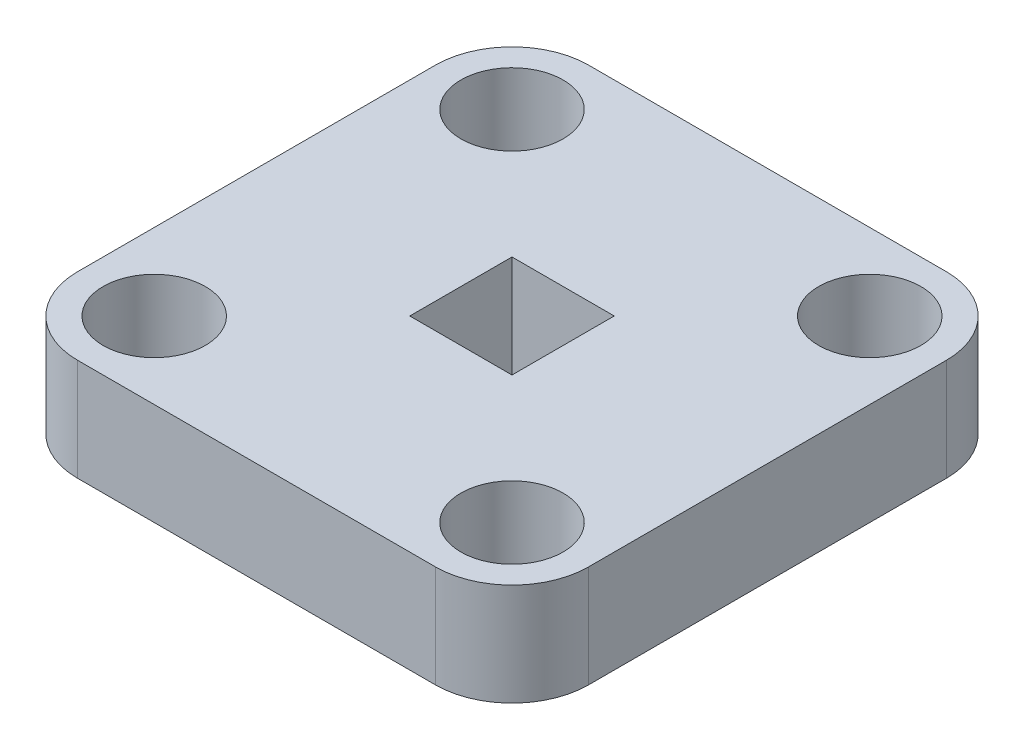
ISO-10303-21;
HEADER;
FILE_DESCRIPTION(('STEP AP214'),'2;1');
FILE_NAME('part.step','',(''),(''),'','','');
FILE_SCHEMA(('AUTOMOTIVE_DESIGN { 1 0 10303 214 1 1 1 1 }'));
ENDSEC;
DATA;
#1=APPLICATION_CONTEXT('core data for automotive mechanical design processes');
#2=APPLICATION_PROTOCOL_DEFINITION('international standard','automotive_design',2000,#1);
#3=PRODUCT_CONTEXT('',#1,'mechanical');
#4=PRODUCT('Part','Part','',(#3));
#5=PRODUCT_RELATED_PRODUCT_CATEGORY('part','',(#4));
#6=PRODUCT_DEFINITION_FORMATION('','',#4);
#7=PRODUCT_DEFINITION_CONTEXT('part definition',#1,'design');
#8=PRODUCT_DEFINITION('design','',#6,#7);
#9=PRODUCT_DEFINITION_SHAPE('','',#8);
#10=(LENGTH_UNIT() NAMED_UNIT(*) SI_UNIT(.MILLI.,.METRE.));
#11=(NAMED_UNIT(*) PLANE_ANGLE_UNIT() SI_UNIT($,.RADIAN.));
#12=(NAMED_UNIT(*) SI_UNIT($,.STERADIAN.) SOLID_ANGLE_UNIT());
#13=UNCERTAINTY_MEASURE_WITH_UNIT(LENGTH_MEASURE(1.E-05),#10,'distance_accuracy_value','');
#14=(GEOMETRIC_REPRESENTATION_CONTEXT(3) GLOBAL_UNCERTAINTY_ASSIGNED_CONTEXT((#13)) GLOBAL_UNIT_ASSIGNED_CONTEXT((#10,
#11,#12)) REPRESENTATION_CONTEXT('',''));
#15=CARTESIAN_POINT('',(0.,0.,0.));
#16=DIRECTION('',(0.,0.,1.));
#17=DIRECTION('',(1.,0.,0.));
#18=AXIS2_PLACEMENT_3D('',#15,#16,#17);
#19=CARTESIAN_POINT('',(0.,4.,0.));
#20=DIRECTION('',(0.,1.,0.));
#21=DIRECTION('',(0.,0.,1.));
#22=AXIS2_PLACEMENT_3D('',#19,#20,#21);
#23=PLANE('',#22);
#24=CARTESIAN_POINT('',(7.,4.,7.));
#25=DIRECTION('',(0.,1.,0.));
#26=DIRECTION('',(0.,0.,1.));
#27=AXIS2_PLACEMENT_3D('',#24,#25,#26);
#28=CIRCLE('',#27,2.);
#29=CARTESIAN_POINT('',(7.,4.,9.));
#30=VERTEX_POINT('',#29);
#31=EDGE_CURVE('E482',#30,#30,#28,.T.);
#32=ORIENTED_EDGE('',*,*,#31,.F.);
#33=EDGE_LOOP('',(#32));
#34=FACE_BOUND('',#33,.T.);
#35=CARTESIAN_POINT('',(-7.,4.,-7.));
#36=DIRECTION('',(0.,1.,0.));
#37=DIRECTION('',(0.,0.,1.));
#38=AXIS2_PLACEMENT_3D('',#35,#36,#37);
#39=CIRCLE('',#38,2.);
#40=CARTESIAN_POINT('',(-7.,4.,-5.));
#41=VERTEX_POINT('',#40);
#42=EDGE_CURVE('E177',#41,#41,#39,.T.);
#43=ORIENTED_EDGE('',*,*,#42,.F.);
#44=EDGE_LOOP('',(#43));
#45=FACE_BOUND('',#44,.T.);
#46=DIRECTION('',(1.,0.,0.));
#47=VECTOR('',#46,1.);
#48=CARTESIAN_POINT('',(-10.,4.,10.));
#49=LINE('',#48,#47);
#50=CARTESIAN_POINT('',(-7.,4.,10.));
#51=VERTEX_POINT('',#50);
#52=CARTESIAN_POINT('',(7.,4.,10.));
#53=VERTEX_POINT('',#52);
#54=EDGE_CURVE('E198',#51,#53,#49,.T.);
#55=ORIENTED_EDGE('',*,*,#54,.T.);
#56=CARTESIAN_POINT('',(7.,4.,7.));
#57=DIRECTION('',(0.,1.,0.));
#58=DIRECTION('',(0.,0.,1.));
#59=AXIS2_PLACEMENT_3D('',#56,#57,#58);
#60=CIRCLE('',#59,3.);
#61=CARTESIAN_POINT('',(10.,4.,7.));
#62=VERTEX_POINT('',#61);
#63=EDGE_CURVE('E256',#53,#62,#60,.T.);
#64=ORIENTED_EDGE('',*,*,#63,.T.);
#65=DIRECTION('',(0.,0.,-1.));
#66=VECTOR('',#65,1.);
#67=CARTESIAN_POINT('',(10.,4.,-10.));
#68=LINE('',#67,#66);
#69=CARTESIAN_POINT('',(10.,4.,-7.));
#70=VERTEX_POINT('',#69);
#71=EDGE_CURVE('E203',#62,#70,#68,.T.);
#72=ORIENTED_EDGE('',*,*,#71,.T.);
#73=CARTESIAN_POINT('',(7.,4.,-7.));
#74=DIRECTION('',(0.,1.,0.));
#75=DIRECTION('',(0.,0.,1.));
#76=AXIS2_PLACEMENT_3D('',#73,#74,#75);
#77=CIRCLE('',#76,3.);
#78=CARTESIAN_POINT('',(7.,4.,-10.));
#79=VERTEX_POINT('',#78);
#80=EDGE_CURVE('E68',#70,#79,#77,.T.);
#81=ORIENTED_EDGE('',*,*,#80,.T.);
#82=DIRECTION('',(-1.,0.,0.));
#83=VECTOR('',#82,1.);
#84=CARTESIAN_POINT('',(-10.,4.,-10.));
#85=LINE('',#84,#83);
#86=CARTESIAN_POINT('',(-7.,4.,-10.));
#87=VERTEX_POINT('',#86);
#88=EDGE_CURVE('E206',#79,#87,#85,.T.);
#89=ORIENTED_EDGE('',*,*,#88,.T.);
#90=CARTESIAN_POINT('',(-7.,4.,-7.));
#91=DIRECTION('',(0.,1.,0.));
#92=DIRECTION('',(0.,0.,1.));
#93=AXIS2_PLACEMENT_3D('',#90,#91,#92);
#94=CIRCLE('',#93,3.);
#95=CARTESIAN_POINT('',(-10.,4.,-7.));
#96=VERTEX_POINT('',#95);
#97=EDGE_CURVE('E251',#87,#96,#94,.T.);
#98=ORIENTED_EDGE('',*,*,#97,.T.);
#99=DIRECTION('',(0.,0.,1.));
#100=VECTOR('',#99,1.);
#101=CARTESIAN_POINT('',(-10.,4.,-10.));
#102=LINE('',#101,#100);
#103=CARTESIAN_POINT('',(-10.,4.,7.));
#104=VERTEX_POINT('',#103);
#105=EDGE_CURVE('E194',#96,#104,#102,.T.);
#106=ORIENTED_EDGE('',*,*,#105,.T.);
#107=CARTESIAN_POINT('',(-7.,4.,7.));
#108=DIRECTION('',(0.,1.,0.));
#109=DIRECTION('',(0.,0.,1.));
#110=AXIS2_PLACEMENT_3D('',#107,#108,#109);
#111=CIRCLE('',#110,3.);
#112=EDGE_CURVE('E248',#104,#51,#111,.T.);
#113=ORIENTED_EDGE('',*,*,#112,.T.);
#114=EDGE_LOOP('',(#55,#64,#72,#81,#89,#98,#106,#113));
#115=FACE_BOUND('',#114,.T.);
#116=DIRECTION('',(-1.,0.,0.));
#117=VECTOR('',#116,1.);
#118=CARTESIAN_POINT('',(-2.,4.,-2.));
#119=LINE('',#118,#117);
#120=CARTESIAN_POINT('',(2.,4.,-2.));
#121=VERTEX_POINT('',#120);
#122=CARTESIAN_POINT('',(-2.,4.,-2.));
#123=VERTEX_POINT('',#122);
#124=EDGE_CURVE('E149',#121,#123,#119,.T.);
#125=ORIENTED_EDGE('',*,*,#124,.F.);
#126=DIRECTION('',(0.,0.,-1.));
#127=VECTOR('',#126,1.);
#128=CARTESIAN_POINT('',(2.,4.,-2.));
#129=LINE('',#128,#127);
#130=CARTESIAN_POINT('',(2.,4.,2.));
#131=VERTEX_POINT('',#130);
#132=EDGE_CURVE('E138',#131,#121,#129,.T.);
#133=ORIENTED_EDGE('',*,*,#132,.F.);
#134=DIRECTION('',(1.,0.,0.));
#135=VECTOR('',#134,1.);
#136=CARTESIAN_POINT('',(-2.,4.,2.));
#137=LINE('',#136,#135);
#138=CARTESIAN_POINT('',(-2.,4.,2.));
#139=VERTEX_POINT('',#138);
#140=EDGE_CURVE('E168',#139,#131,#137,.T.);
#141=ORIENTED_EDGE('',*,*,#140,.F.);
#142=DIRECTION('',(0.,0.,1.));
#143=VECTOR('',#142,1.);
#144=CARTESIAN_POINT('',(-2.,4.,-2.));
#145=LINE('',#144,#143);
#146=EDGE_CURVE('E164',#123,#139,#145,.T.);
#147=ORIENTED_EDGE('',*,*,#146,.F.);
#148=EDGE_LOOP('',(#125,#133,#141,#147));
#149=FACE_BOUND('',#148,.T.);
#150=CARTESIAN_POINT('',(7.,4.,-7.));
#151=DIRECTION('',(0.,1.,0.));
#152=DIRECTION('',(0.,0.,1.));
#153=AXIS2_PLACEMENT_3D('',#150,#151,#152);
#154=CIRCLE('',#153,2.);
#155=CARTESIAN_POINT('',(7.,4.,-5.));
#156=VERTEX_POINT('',#155);
#157=EDGE_CURVE('E488',#156,#156,#154,.T.);
#158=ORIENTED_EDGE('',*,*,#157,.F.);
#159=EDGE_LOOP('',(#158));
#160=FACE_BOUND('',#159,.T.);
#161=CARTESIAN_POINT('',(-7.,4.,7.));
#162=DIRECTION('',(0.,1.,0.));
#163=DIRECTION('',(0.,0.,1.));
#164=AXIS2_PLACEMENT_3D('',#161,#162,#163);
#165=CIRCLE('',#164,2.);
#166=CARTESIAN_POINT('',(-7.,4.,9.));
#167=VERTEX_POINT('',#166);
#168=EDGE_CURVE('E477',#167,#167,#165,.T.);
#169=ORIENTED_EDGE('',*,*,#168,.F.);
#170=EDGE_LOOP('',(#169));
#171=FACE_BOUND('',#170,.T.);
#172=ADVANCED_FACE('F45',(#34,#45,#115,#149,#160,#171),#23,.T.);
#173=CARTESIAN_POINT('',(0.,0.,0.));
#174=DIRECTION('',(0.,1.,0.));
#175=DIRECTION('',(0.,0.,1.));
#176=AXIS2_PLACEMENT_3D('',#173,#174,#175);
#177=PLANE('',#176);
#178=DIRECTION('',(0.,0.,-1.));
#179=VECTOR('',#178,1.);
#180=CARTESIAN_POINT('',(10.,0.,-10.));
#181=LINE('',#180,#179);
#182=CARTESIAN_POINT('',(10.,0.,7.));
#183=VERTEX_POINT('',#182);
#184=CARTESIAN_POINT('',(10.,0.,-7.));
#185=VERTEX_POINT('',#184);
#186=EDGE_CURVE('E217',#183,#185,#181,.T.);
#187=ORIENTED_EDGE('',*,*,#186,.F.);
#188=CARTESIAN_POINT('',(7.,0.,7.));
#189=DIRECTION('',(0.,1.,0.));
#190=DIRECTION('',(0.,0.,1.));
#191=AXIS2_PLACEMENT_3D('',#188,#189,#190);
#192=CIRCLE('',#191,3.);
#193=CARTESIAN_POINT('',(7.,0.,10.));
#194=VERTEX_POINT('',#193);
#195=EDGE_CURVE('E238',#183,#194,#192,.F.);
#196=ORIENTED_EDGE('',*,*,#195,.T.);
#197=DIRECTION('',(1.,0.,0.));
#198=VECTOR('',#197,1.);
#199=CARTESIAN_POINT('',(-10.,0.,10.));
#200=LINE('',#199,#198);
#201=CARTESIAN_POINT('',(-7.,0.,10.));
#202=VERTEX_POINT('',#201);
#203=EDGE_CURVE('E213',#202,#194,#200,.T.);
#204=ORIENTED_EDGE('',*,*,#203,.F.);
#205=CARTESIAN_POINT('',(-7.,0.,7.));
#206=DIRECTION('',(0.,1.,0.));
#207=DIRECTION('',(0.,0.,1.));
#208=AXIS2_PLACEMENT_3D('',#205,#206,#207);
#209=CIRCLE('',#208,3.);
#210=CARTESIAN_POINT('',(-10.,0.,7.));
#211=VERTEX_POINT('',#210);
#212=EDGE_CURVE('E229',#202,#211,#209,.F.);
#213=ORIENTED_EDGE('',*,*,#212,.T.);
#214=DIRECTION('',(0.,0.,1.));
#215=VECTOR('',#214,1.);
#216=CARTESIAN_POINT('',(-10.,0.,-10.));
#217=LINE('',#216,#215);
#218=CARTESIAN_POINT('',(-10.,0.,-7.));
#219=VERTEX_POINT('',#218);
#220=EDGE_CURVE('E158',#219,#211,#217,.T.);
#221=ORIENTED_EDGE('',*,*,#220,.F.);
#222=CARTESIAN_POINT('',(-7.,0.,-7.));
#223=DIRECTION('',(0.,1.,0.));
#224=DIRECTION('',(0.,0.,1.));
#225=AXIS2_PLACEMENT_3D('',#222,#223,#224);
#226=CIRCLE('',#225,3.);
#227=CARTESIAN_POINT('',(-7.,0.,-10.));
#228=VERTEX_POINT('',#227);
#229=EDGE_CURVE('E232',#219,#228,#226,.F.);
#230=ORIENTED_EDGE('',*,*,#229,.T.);
#231=DIRECTION('',(-1.,0.,0.));
#232=VECTOR('',#231,1.);
#233=CARTESIAN_POINT('',(-10.,0.,-10.));
#234=LINE('',#233,#232);
#235=CARTESIAN_POINT('',(7.,0.,-10.));
#236=VERTEX_POINT('',#235);
#237=EDGE_CURVE('E199',#236,#228,#234,.T.);
#238=ORIENTED_EDGE('',*,*,#237,.F.);
#239=CARTESIAN_POINT('',(7.,0.,-7.));
#240=DIRECTION('',(0.,1.,0.));
#241=DIRECTION('',(0.,0.,1.));
#242=AXIS2_PLACEMENT_3D('',#239,#240,#241);
#243=CIRCLE('',#242,3.);
#244=EDGE_CURVE('E235',#236,#185,#243,.F.);
#245=ORIENTED_EDGE('',*,*,#244,.T.);
#246=EDGE_LOOP('',(#187,#196,#204,#213,#221,#230,#238,#245));
#247=FACE_BOUND('',#246,.T.);
#248=DIRECTION('',(0.,0.,-1.));
#249=VECTOR('',#248,1.);
#250=CARTESIAN_POINT('',(2.,0.,-2.));
#251=LINE('',#250,#249);
#252=CARTESIAN_POINT('',(2.,0.,2.));
#253=VERTEX_POINT('',#252);
#254=CARTESIAN_POINT('',(2.,0.,-2.));
#255=VERTEX_POINT('',#254);
#256=EDGE_CURVE('E174',#253,#255,#251,.T.);
#257=ORIENTED_EDGE('',*,*,#256,.T.);
#258=DIRECTION('',(-1.,0.,0.));
#259=VECTOR('',#258,1.);
#260=CARTESIAN_POINT('',(-2.,0.,-2.));
#261=LINE('',#260,#259);
#262=CARTESIAN_POINT('',(-2.,0.,-2.));
#263=VERTEX_POINT('',#262);
#264=EDGE_CURVE('E156',#255,#263,#261,.T.);
#265=ORIENTED_EDGE('',*,*,#264,.T.);
#266=DIRECTION('',(0.,0.,1.));
#267=VECTOR('',#266,1.);
#268=CARTESIAN_POINT('',(-2.,0.,-2.));
#269=LINE('',#268,#267);
#270=CARTESIAN_POINT('',(-2.,0.,2.));
#271=VERTEX_POINT('',#270);
#272=EDGE_CURVE('E180',#263,#271,#269,.T.);
#273=ORIENTED_EDGE('',*,*,#272,.T.);
#274=DIRECTION('',(1.,0.,0.));
#275=VECTOR('',#274,1.);
#276=CARTESIAN_POINT('',(-2.,0.,2.));
#277=LINE('',#276,#275);
#278=EDGE_CURVE('E150',#271,#253,#277,.T.);
#279=ORIENTED_EDGE('',*,*,#278,.T.);
#280=EDGE_LOOP('',(#257,#265,#273,#279));
#281=FACE_BOUND('',#280,.T.);
#282=CARTESIAN_POINT('',(-7.,0.,-7.));
#283=DIRECTION('',(0.,1.,0.));
#284=DIRECTION('',(0.,0.,1.));
#285=AXIS2_PLACEMENT_3D('',#282,#283,#284);
#286=CIRCLE('',#285,2.);
#287=CARTESIAN_POINT('',(-7.,0.,-5.));
#288=VERTEX_POINT('',#287);
#289=EDGE_CURVE('E464',#288,#288,#286,.T.);
#290=ORIENTED_EDGE('',*,*,#289,.T.);
#291=EDGE_LOOP('',(#290));
#292=FACE_BOUND('',#291,.T.);
#293=CARTESIAN_POINT('',(7.,0.,-7.));
#294=DIRECTION('',(0.,1.,0.));
#295=DIRECTION('',(0.,0.,1.));
#296=AXIS2_PLACEMENT_3D('',#293,#294,#295);
#297=CIRCLE('',#296,2.);
#298=CARTESIAN_POINT('',(7.,0.,-5.));
#299=VERTEX_POINT('',#298);
#300=EDGE_CURVE('E468',#299,#299,#297,.T.);
#301=ORIENTED_EDGE('',*,*,#300,.T.);
#302=EDGE_LOOP('',(#301));
#303=FACE_BOUND('',#302,.T.);
#304=CARTESIAN_POINT('',(7.,0.,7.));
#305=DIRECTION('',(0.,1.,0.));
#306=DIRECTION('',(0.,0.,1.));
#307=AXIS2_PLACEMENT_3D('',#304,#305,#306);
#308=CIRCLE('',#307,2.);
#309=CARTESIAN_POINT('',(7.,0.,9.));
#310=VERTEX_POINT('',#309);
#311=EDGE_CURVE('E472',#310,#310,#308,.T.);
#312=ORIENTED_EDGE('',*,*,#311,.T.);
#313=EDGE_LOOP('',(#312));
#314=FACE_BOUND('',#313,.T.);
#315=CARTESIAN_POINT('',(-7.,0.,7.));
#316=DIRECTION('',(0.,1.,0.));
#317=DIRECTION('',(0.,0.,1.));
#318=AXIS2_PLACEMENT_3D('',#315,#316,#317);
#319=CIRCLE('',#318,2.);
#320=CARTESIAN_POINT('',(-7.,0.,9.));
#321=VERTEX_POINT('',#320);
#322=EDGE_CURVE('E475',#321,#321,#319,.T.);
#323=ORIENTED_EDGE('',*,*,#322,.T.);
#324=EDGE_LOOP('',(#323));
#325=FACE_BOUND('',#324,.T.);
#326=ADVANCED_FACE('F282',(#247,#281,#292,#303,#314,#325),#177,.F.);
#327=CARTESIAN_POINT('',(-10.,4.,-10.));
#328=DIRECTION('',(1.,0.,0.));
#329=DIRECTION('',(0.,0.,-1.));
#330=AXIS2_PLACEMENT_3D('',#327,#328,#329);
#331=PLANE('',#330);
#332=ORIENTED_EDGE('',*,*,#105,.F.);
#333=DIRECTION('',(0.,-1.,0.));
#334=VECTOR('',#333,1.);
#335=CARTESIAN_POINT('',(-10.,4.,-7.));
#336=LINE('',#335,#334);
#337=EDGE_CURVE('E11',#96,#219,#336,.T.);
#338=ORIENTED_EDGE('',*,*,#337,.T.);
#339=ORIENTED_EDGE('',*,*,#220,.T.);
#340=DIRECTION('',(0.,-1.,0.));
#341=VECTOR('',#340,1.);
#342=CARTESIAN_POINT('',(-10.,4.,7.));
#343=LINE('',#342,#341);
#344=EDGE_CURVE('E54',#211,#104,#343,.F.);
#345=ORIENTED_EDGE('',*,*,#344,.T.);
#346=EDGE_LOOP('',(#332,#338,#339,#345));
#347=FACE_BOUND('',#346,.T.);
#348=ADVANCED_FACE('F268',(#347),#331,.F.);
#349=CARTESIAN_POINT('',(-10.,4.,10.));
#350=DIRECTION('',(0.,0.,-1.));
#351=DIRECTION('',(-1.,0.,0.));
#352=AXIS2_PLACEMENT_3D('',#349,#350,#351);
#353=PLANE('',#352);
#354=ORIENTED_EDGE('',*,*,#203,.T.);
#355=DIRECTION('',(0.,-1.,0.));
#356=VECTOR('',#355,1.);
#357=CARTESIAN_POINT('',(7.,4.,10.));
#358=LINE('',#357,#356);
#359=EDGE_CURVE('E245',#194,#53,#358,.F.);
#360=ORIENTED_EDGE('',*,*,#359,.T.);
#361=ORIENTED_EDGE('',*,*,#54,.F.);
#362=DIRECTION('',(0.,-1.,0.));
#363=VECTOR('',#362,1.);
#364=CARTESIAN_POINT('',(-7.,4.,10.));
#365=LINE('',#364,#363);
#366=EDGE_CURVE('E241',#51,#202,#365,.T.);
#367=ORIENTED_EDGE('',*,*,#366,.T.);
#368=EDGE_LOOP('',(#354,#360,#361,#367));
#369=FACE_BOUND('',#368,.T.);
#370=ADVANCED_FACE('F278',(#369),#353,.F.);
#371=CARTESIAN_POINT('',(10.,4.,-10.));
#372=DIRECTION('',(-1.,0.,0.));
#373=DIRECTION('',(0.,0.,1.));
#374=AXIS2_PLACEMENT_3D('',#371,#372,#373);
#375=PLANE('',#374);
#376=ORIENTED_EDGE('',*,*,#71,.F.);
#377=DIRECTION('',(0.,-1.,0.));
#378=VECTOR('',#377,1.);
#379=CARTESIAN_POINT('',(10.,4.,7.));
#380=LINE('',#379,#378);
#381=EDGE_CURVE('E225',#62,#183,#380,.T.);
#382=ORIENTED_EDGE('',*,*,#381,.T.);
#383=ORIENTED_EDGE('',*,*,#186,.T.);
#384=DIRECTION('',(0.,-1.,0.));
#385=VECTOR('',#384,1.);
#386=CARTESIAN_POINT('',(10.,4.,-7.));
#387=LINE('',#386,#385);
#388=EDGE_CURVE('E209',#185,#70,#387,.F.);
#389=ORIENTED_EDGE('',*,*,#388,.T.);
#390=EDGE_LOOP('',(#376,#382,#383,#389));
#391=FACE_BOUND('',#390,.T.);
#392=ADVANCED_FACE('F290',(#391),#375,.F.);
#393=CARTESIAN_POINT('',(-10.,4.,-10.));
#394=DIRECTION('',(0.,0.,1.));
#395=DIRECTION('',(1.,0.,0.));
#396=AXIS2_PLACEMENT_3D('',#393,#394,#395);
#397=PLANE('',#396);
#398=ORIENTED_EDGE('',*,*,#88,.F.);
#399=DIRECTION('',(0.,-1.,0.));
#400=VECTOR('',#399,1.);
#401=CARTESIAN_POINT('',(7.,4.,-10.));
#402=LINE('',#401,#400);
#403=EDGE_CURVE('E261',#79,#236,#402,.T.);
#404=ORIENTED_EDGE('',*,*,#403,.T.);
#405=ORIENTED_EDGE('',*,*,#237,.T.);
#406=DIRECTION('',(0.,-1.,0.));
#407=VECTOR('',#406,1.);
#408=CARTESIAN_POINT('',(-7.,4.,-10.));
#409=LINE('',#408,#407);
#410=EDGE_CURVE('E61',#228,#87,#409,.F.);
#411=ORIENTED_EDGE('',*,*,#410,.T.);
#412=EDGE_LOOP('',(#398,#404,#405,#411));
#413=FACE_BOUND('',#412,.T.);
#414=ADVANCED_FACE('F296',(#413),#397,.F.);
#415=CARTESIAN_POINT('',(2.,4.,-2.));
#416=DIRECTION('',(-1.,0.,0.));
#417=DIRECTION('',(0.,0.,1.));
#418=AXIS2_PLACEMENT_3D('',#415,#416,#417);
#419=PLANE('',#418);
#420=ORIENTED_EDGE('',*,*,#256,.F.);
#421=DIRECTION('',(0.,-1.,0.));
#422=VECTOR('',#421,1.);
#423=CARTESIAN_POINT('',(2.,4.,2.));
#424=LINE('',#423,#422);
#425=EDGE_CURVE('E144',#131,#253,#424,.T.);
#426=ORIENTED_EDGE('',*,*,#425,.F.);
#427=ORIENTED_EDGE('',*,*,#132,.T.);
#428=DIRECTION('',(0.,-1.,0.));
#429=VECTOR('',#428,1.);
#430=CARTESIAN_POINT('',(2.,4.,-2.));
#431=LINE('',#430,#429);
#432=EDGE_CURVE('E141',#121,#255,#431,.T.);
#433=ORIENTED_EDGE('',*,*,#432,.T.);
#434=EDGE_LOOP('',(#420,#426,#427,#433));
#435=FACE_BOUND('',#434,.T.);
#436=ADVANCED_FACE('F140',(#435),#419,.T.);
#437=CARTESIAN_POINT('',(-2.,4.,-2.));
#438=DIRECTION('',(0.,0.,1.));
#439=DIRECTION('',(1.,0.,0.));
#440=AXIS2_PLACEMENT_3D('',#437,#438,#439);
#441=PLANE('',#440);
#442=ORIENTED_EDGE('',*,*,#264,.F.);
#443=ORIENTED_EDGE('',*,*,#432,.F.);
#444=ORIENTED_EDGE('',*,*,#124,.T.);
#445=DIRECTION('',(0.,-1.,0.));
#446=VECTOR('',#445,1.);
#447=CARTESIAN_POINT('',(-2.,4.,-2.));
#448=LINE('',#447,#446);
#449=EDGE_CURVE('E159',#123,#263,#448,.T.);
#450=ORIENTED_EDGE('',*,*,#449,.T.);
#451=EDGE_LOOP('',(#442,#443,#444,#450));
#452=FACE_BOUND('',#451,.T.);
#453=ADVANCED_FACE('F153',(#452),#441,.T.);
#454=CARTESIAN_POINT('',(-2.,4.,-2.));
#455=DIRECTION('',(1.,0.,0.));
#456=DIRECTION('',(0.,0.,-1.));
#457=AXIS2_PLACEMENT_3D('',#454,#455,#456);
#458=PLANE('',#457);
#459=ORIENTED_EDGE('',*,*,#272,.F.);
#460=ORIENTED_EDGE('',*,*,#449,.F.);
#461=ORIENTED_EDGE('',*,*,#146,.T.);
#462=DIRECTION('',(0.,-1.,0.));
#463=VECTOR('',#462,1.);
#464=CARTESIAN_POINT('',(-2.,4.,2.));
#465=LINE('',#464,#463);
#466=EDGE_CURVE('E189',#139,#271,#465,.T.);
#467=ORIENTED_EDGE('',*,*,#466,.T.);
#468=EDGE_LOOP('',(#459,#460,#461,#467));
#469=FACE_BOUND('',#468,.T.);
#470=ADVANCED_FACE('F352',(#469),#458,.T.);
#471=CARTESIAN_POINT('',(-2.,4.,2.));
#472=DIRECTION('',(0.,0.,-1.));
#473=DIRECTION('',(-1.,0.,0.));
#474=AXIS2_PLACEMENT_3D('',#471,#472,#473);
#475=PLANE('',#474);
#476=ORIENTED_EDGE('',*,*,#278,.F.);
#477=ORIENTED_EDGE('',*,*,#466,.F.);
#478=ORIENTED_EDGE('',*,*,#140,.T.);
#479=ORIENTED_EDGE('',*,*,#425,.T.);
#480=EDGE_LOOP('',(#476,#477,#478,#479));
#481=FACE_BOUND('',#480,.T.);
#482=ADVANCED_FACE('F348',(#481),#475,.T.);
#483=CARTESIAN_POINT('',(-7.,4.,-7.));
#484=DIRECTION('',(0.,-1.,0.));
#485=DIRECTION('',(0.,0.,-1.));
#486=AXIS2_PLACEMENT_3D('',#483,#484,#485);
#487=CYLINDRICAL_SURFACE('',#486,2.);
#488=ORIENTED_EDGE('',*,*,#42,.T.);
#489=EDGE_LOOP('',(#488));
#490=FACE_BOUND('',#489,.T.);
#491=ORIENTED_EDGE('',*,*,#289,.F.);
#492=EDGE_LOOP('',(#491));
#493=FACE_BOUND('',#492,.T.);
#494=ADVANCED_FACE('F344',(#490,#493),#487,.F.);
#495=CARTESIAN_POINT('',(7.,4.,-7.));
#496=DIRECTION('',(0.,-1.,0.));
#497=DIRECTION('',(0.,0.,-1.));
#498=AXIS2_PLACEMENT_3D('',#495,#496,#497);
#499=CYLINDRICAL_SURFACE('',#498,2.);
#500=ORIENTED_EDGE('',*,*,#157,.T.);
#501=EDGE_LOOP('',(#500));
#502=FACE_BOUND('',#501,.T.);
#503=ORIENTED_EDGE('',*,*,#300,.F.);
#504=EDGE_LOOP('',(#503));
#505=FACE_BOUND('',#504,.T.);
#506=ADVANCED_FACE('F336',(#502,#505),#499,.F.);
#507=CARTESIAN_POINT('',(7.,4.,7.));
#508=DIRECTION('',(0.,-1.,0.));
#509=DIRECTION('',(0.,0.,-1.));
#510=AXIS2_PLACEMENT_3D('',#507,#508,#509);
#511=CYLINDRICAL_SURFACE('',#510,2.);
#512=ORIENTED_EDGE('',*,*,#31,.T.);
#513=EDGE_LOOP('',(#512));
#514=FACE_BOUND('',#513,.T.);
#515=ORIENTED_EDGE('',*,*,#311,.F.);
#516=EDGE_LOOP('',(#515));
#517=FACE_BOUND('',#516,.T.);
#518=ADVANCED_FACE('F330',(#514,#517),#511,.F.);
#519=CARTESIAN_POINT('',(-7.,4.,7.));
#520=DIRECTION('',(0.,-1.,0.));
#521=DIRECTION('',(0.,0.,-1.));
#522=AXIS2_PLACEMENT_3D('',#519,#520,#521);
#523=CYLINDRICAL_SURFACE('',#522,2.);
#524=ORIENTED_EDGE('',*,*,#168,.T.);
#525=EDGE_LOOP('',(#524));
#526=FACE_BOUND('',#525,.T.);
#527=ORIENTED_EDGE('',*,*,#322,.F.);
#528=EDGE_LOOP('',(#527));
#529=FACE_BOUND('',#528,.T.);
#530=ADVANCED_FACE('F327',(#526,#529),#523,.F.);
#531=CARTESIAN_POINT('',(7.,4.,7.));
#532=DIRECTION('',(0.,-1.,0.));
#533=DIRECTION('',(0.,0.,-1.));
#534=AXIS2_PLACEMENT_3D('',#531,#532,#533);
#535=CYLINDRICAL_SURFACE('',#534,3.);
#536=ORIENTED_EDGE('',*,*,#63,.F.);
#537=ORIENTED_EDGE('',*,*,#359,.F.);
#538=ORIENTED_EDGE('',*,*,#195,.F.);
#539=ORIENTED_EDGE('',*,*,#381,.F.);
#540=EDGE_LOOP('',(#536,#537,#538,#539));
#541=FACE_BOUND('',#540,.T.);
#542=ADVANCED_FACE('F287',(#541),#535,.T.);
#543=CARTESIAN_POINT('',(7.,4.,-7.));
#544=DIRECTION('',(0.,-1.,0.));
#545=DIRECTION('',(0.,0.,-1.));
#546=AXIS2_PLACEMENT_3D('',#543,#544,#545);
#547=CYLINDRICAL_SURFACE('',#546,3.);
#548=ORIENTED_EDGE('',*,*,#80,.F.);
#549=ORIENTED_EDGE('',*,*,#388,.F.);
#550=ORIENTED_EDGE('',*,*,#244,.F.);
#551=ORIENTED_EDGE('',*,*,#403,.F.);
#552=EDGE_LOOP('',(#548,#549,#550,#551));
#553=FACE_BOUND('',#552,.T.);
#554=ADVANCED_FACE('F294',(#553),#547,.T.);
#555=CARTESIAN_POINT('',(-7.,4.,-7.));
#556=DIRECTION('',(0.,-1.,0.));
#557=DIRECTION('',(0.,0.,-1.));
#558=AXIS2_PLACEMENT_3D('',#555,#556,#557);
#559=CYLINDRICAL_SURFACE('',#558,3.);
#560=ORIENTED_EDGE('',*,*,#97,.F.);
#561=ORIENTED_EDGE('',*,*,#410,.F.);
#562=ORIENTED_EDGE('',*,*,#229,.F.);
#563=ORIENTED_EDGE('',*,*,#337,.F.);
#564=EDGE_LOOP('',(#560,#561,#562,#563));
#565=FACE_BOUND('',#564,.T.);
#566=ADVANCED_FACE('F298',(#565),#559,.T.);
#567=CARTESIAN_POINT('',(-7.,4.,7.));
#568=DIRECTION('',(0.,-1.,0.));
#569=DIRECTION('',(0.,0.,-1.));
#570=AXIS2_PLACEMENT_3D('',#567,#568,#569);
#571=CYLINDRICAL_SURFACE('',#570,3.);
#572=ORIENTED_EDGE('',*,*,#112,.F.);
#573=ORIENTED_EDGE('',*,*,#344,.F.);
#574=ORIENTED_EDGE('',*,*,#212,.F.);
#575=ORIENTED_EDGE('',*,*,#366,.F.);
#576=EDGE_LOOP('',(#572,#573,#574,#575));
#577=FACE_BOUND('',#576,.T.);
#578=ADVANCED_FACE('F47',(#577),#571,.T.);
#579=CLOSED_SHELL('',(#172,#326,#348,#370,#392,#414,#436,#453,#470,#482,#494,#506,#518,#530,
#542,#554,#566,#578));
#580=MANIFOLD_SOLID_BREP('B2',#579);
#581=ADVANCED_BREP_SHAPE_REPRESENTATION('',(#18,#580),#14);
#582=SHAPE_DEFINITION_REPRESENTATION(#9,#581);
ENDSEC;
END-ISO-10303-21;
